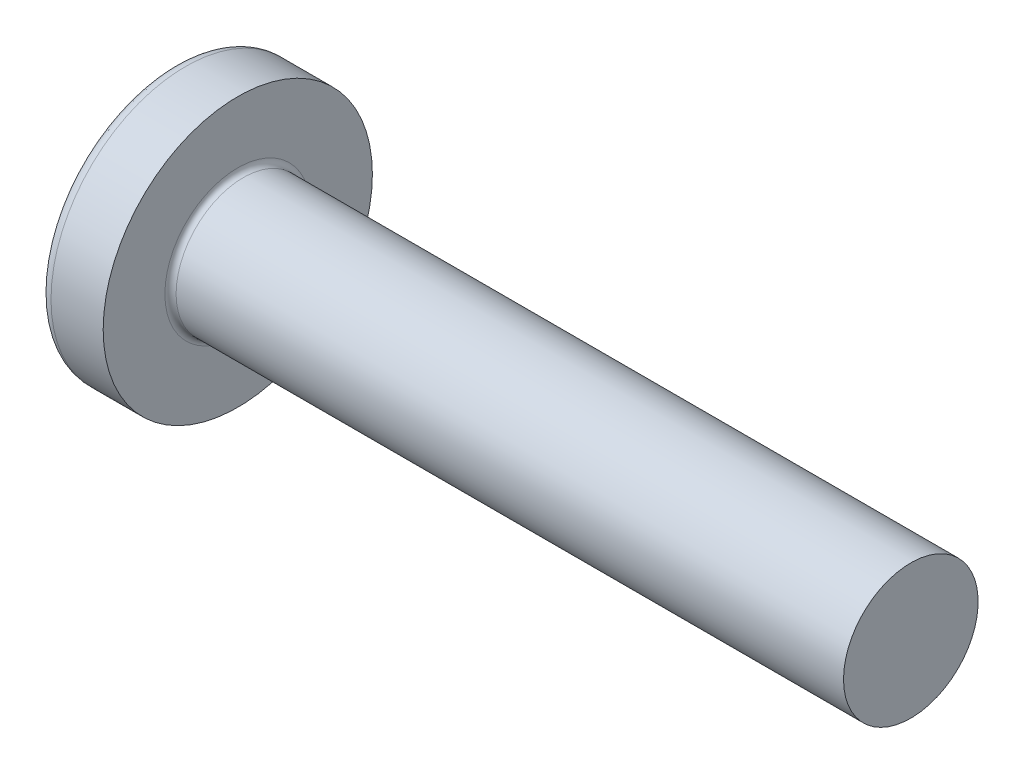
ISO-10303-21;
HEADER;
FILE_DESCRIPTION(('STEP AP214'),'2;1');
FILE_NAME('part.step','',(''),(''),'','','');
FILE_SCHEMA(('AUTOMOTIVE_DESIGN { 1 0 10303 214 1 1 1 1 }'));
ENDSEC;
DATA;
#1=APPLICATION_CONTEXT('core data for automotive mechanical design processes');
#2=APPLICATION_PROTOCOL_DEFINITION('international standard','automotive_design',2000,#1);
#3=PRODUCT_CONTEXT('',#1,'mechanical');
#4=PRODUCT('Part','Part','',(#3));
#5=PRODUCT_RELATED_PRODUCT_CATEGORY('part','',(#4));
#6=PRODUCT_DEFINITION_FORMATION('','',#4);
#7=PRODUCT_DEFINITION_CONTEXT('part definition',#1,'design');
#8=PRODUCT_DEFINITION('design','',#6,#7);
#9=PRODUCT_DEFINITION_SHAPE('','',#8);
#10=(LENGTH_UNIT() NAMED_UNIT(*) SI_UNIT(.MILLI.,.METRE.));
#11=(NAMED_UNIT(*) PLANE_ANGLE_UNIT() SI_UNIT($,.RADIAN.));
#12=(NAMED_UNIT(*) SI_UNIT($,.STERADIAN.) SOLID_ANGLE_UNIT());
#13=UNCERTAINTY_MEASURE_WITH_UNIT(LENGTH_MEASURE(1.E-05),#10,'distance_accuracy_value','');
#14=(GEOMETRIC_REPRESENTATION_CONTEXT(3) GLOBAL_UNCERTAINTY_ASSIGNED_CONTEXT((#13)) GLOBAL_UNIT_ASSIGNED_CONTEXT((#10,
#11,#12)) REPRESENTATION_CONTEXT('',''));
#15=CARTESIAN_POINT('',(0.,0.,0.));
#16=DIRECTION('',(0.,0.,1.));
#17=DIRECTION('',(1.,0.,0.));
#18=AXIS2_PLACEMENT_3D('',#15,#16,#17);
#19=CARTESIAN_POINT('',(10.,0.,0.));
#20=DIRECTION('',(-1.,0.,0.));
#21=DIRECTION('',(0.,1.,0.));
#22=AXIS2_PLACEMENT_3D('',#19,#20,#21);
#23=SPHERICAL_SURFACE('',#22,10.);
#24=CARTESIAN_POINT('',(1.83373872480848,0.,0.));
#25=DIRECTION('',(-1.,0.,0.));
#26=DIRECTION('',(0.,0.,1.));
#27=AXIS2_PLACEMENT_3D('',#24,#25,#26);
#28=CIRCLE('',#27,5.77167019027484);
#29=CARTESIAN_POINT('',(1.83373872480848,0.,5.77167019027484));
#30=VERTEX_POINT('',#29);
#31=EDGE_CURVE('E213',#30,#30,#28,.T.);
#32=ORIENTED_EDGE('',*,*,#31,.T.);
#33=EDGE_LOOP('',(#32));
#34=FACE_BOUND('',#33,.T.);
#35=CARTESIAN_POINT('',(0.11533271177369,0.,0.));
#36=DIRECTION('',(1.,0.,0.));
#37=DIRECTION('',(0.,0.,-1.));
#38=AXIS2_PLACEMENT_3D('',#35,#36,#37);
#39=CIRCLE('',#38,1.51438192047739);
#40=CARTESIAN_POINT('',(0.115332711773696,-0.709999999999994,-1.33762947076864));
#41=VERTEX_POINT('',#40);
#42=CARTESIAN_POINT('',(0.11533271177369,-1.33762947076862,-0.71));
#43=VERTEX_POINT('',#42);
#44=EDGE_CURVE('E339',#41,#43,#39,.F.);
#45=ORIENTED_EDGE('',*,*,#44,.F.);
#46=CARTESIAN_POINT('',(10.,-0.71,0.));
#47=DIRECTION('',(0.,1.,0.));
#48=DIRECTION('',(0.,0.,1.));
#49=AXIS2_PLACEMENT_3D('',#46,#47,#48);
#50=CIRCLE('',#49,9.97476315508293);
#51=CARTESIAN_POINT('',(0.516695966128057,-0.709999999999988,-3.09238493741451));
#52=VERTEX_POINT('',#51);
#53=EDGE_CURVE('E273',#52,#41,#50,.T.);
#54=ORIENTED_EDGE('',*,*,#53,.F.);
#55=CARTESIAN_POINT('',(9.3467899937754,0.,1.3101368059126));
#56=DIRECTION('',(0.446197753347436,0.,-0.894934391398443));
#57=DIRECTION('',(-0.894934391398443,0.,-0.446197753347436));
#58=AXIS2_PLACEMENT_3D('',#55,#56,#57);
#59=CIRCLE('',#58,9.89226254390578);
#60=CARTESIAN_POINT('',(0.516695966128059,0.710000000000011,-3.0923849374145));
#61=VERTEX_POINT('',#60);
#62=EDGE_CURVE('E247',#52,#61,#59,.T.);
#63=ORIENTED_EDGE('',*,*,#62,.T.);
#64=CARTESIAN_POINT('',(10.,0.71,0.));
#65=DIRECTION('',(0.,-1.,0.));
#66=DIRECTION('',(0.,0.,-1.));
#67=AXIS2_PLACEMENT_3D('',#64,#65,#66);
#68=CIRCLE('',#67,9.97476315508293);
#69=CARTESIAN_POINT('',(0.115332711773695,0.710000000000005,-1.33762947076863));
#70=VERTEX_POINT('',#69);
#71=EDGE_CURVE('E301',#70,#61,#68,.T.);
#72=ORIENTED_EDGE('',*,*,#71,.F.);
#73=CARTESIAN_POINT('',(0.11533271177369,1.33762947076861,-0.71));
#74=VERTEX_POINT('',#73);
#75=EDGE_CURVE('E354',#74,#70,#39,.F.);
#76=ORIENTED_EDGE('',*,*,#75,.F.);
#77=CARTESIAN_POINT('',(10.,0.,-0.71));
#78=DIRECTION('',(0.,0.,1.));
#79=DIRECTION('',(1.,0.,0.));
#80=AXIS2_PLACEMENT_3D('',#77,#78,#79);
#81=CIRCLE('',#80,9.97476315508293);
#82=CARTESIAN_POINT('',(0.516695966128059,3.0923849374145,-0.71));
#83=VERTEX_POINT('',#82);
#84=EDGE_CURVE('E241',#83,#74,#81,.T.);
#85=ORIENTED_EDGE('',*,*,#84,.F.);
#86=CARTESIAN_POINT('',(9.3467899937754,-1.3101368059126,0.));
#87=DIRECTION('',(0.446197753347436,0.894934391398443,0.));
#88=DIRECTION('',(-0.894934391398443,0.446197753347436,0.));
#89=AXIS2_PLACEMENT_3D('',#86,#87,#88);
#90=CIRCLE('',#89,9.89226254390578);
#91=CARTESIAN_POINT('',(0.516695966128059,3.09238493741451,0.71));
#92=VERTEX_POINT('',#91);
#93=EDGE_CURVE('E244',#83,#92,#90,.T.);
#94=ORIENTED_EDGE('',*,*,#93,.T.);
#95=CARTESIAN_POINT('',(10.,0.,0.71));
#96=DIRECTION('',(0.,0.,-1.));
#97=DIRECTION('',(-1.,0.,0.));
#98=AXIS2_PLACEMENT_3D('',#95,#96,#97);
#99=CIRCLE('',#98,9.97476315508293);
#100=CARTESIAN_POINT('',(0.11533271177369,1.33762947076861,0.709999999999999));
#101=VERTEX_POINT('',#100);
#102=EDGE_CURVE('E237',#101,#92,#99,.T.);
#103=ORIENTED_EDGE('',*,*,#102,.F.);
#104=CARTESIAN_POINT('',(0.115332711773696,0.709999999999995,1.33762947076864));
#105=VERTEX_POINT('',#104);
#106=EDGE_CURVE('E353',#105,#101,#39,.F.);
#107=ORIENTED_EDGE('',*,*,#106,.F.);
#108=CARTESIAN_POINT('',(0.516695966128059,0.709999999999989,3.09238493741451));
#109=VERTEX_POINT('',#108);
#110=EDGE_CURVE('E257',#109,#105,#68,.T.);
#111=ORIENTED_EDGE('',*,*,#110,.F.);
#112=CARTESIAN_POINT('',(9.3467899937754,0.,-1.3101368059126));
#113=DIRECTION('',(0.446197753347436,0.,0.894934391398443));
#114=DIRECTION('',(0.894934391398443,0.,-0.446197753347436));
#115=AXIS2_PLACEMENT_3D('',#112,#113,#114);
#116=CIRCLE('',#115,9.89226254390578);
#117=CARTESIAN_POINT('',(0.516695966128059,-0.710000000000011,3.0923849374145));
#118=VERTEX_POINT('',#117);
#119=EDGE_CURVE('E48',#109,#118,#116,.T.);
#120=ORIENTED_EDGE('',*,*,#119,.T.);
#121=CARTESIAN_POINT('',(0.115332711773696,-0.710000000000004,1.33762947076863));
#122=VERTEX_POINT('',#121);
#123=EDGE_CURVE('E254',#122,#118,#50,.T.);
#124=ORIENTED_EDGE('',*,*,#123,.F.);
#125=CARTESIAN_POINT('',(0.11533271177369,-1.33762947076862,0.709999999999999));
#126=VERTEX_POINT('',#125);
#127=EDGE_CURVE('E385',#126,#122,#39,.F.);
#128=ORIENTED_EDGE('',*,*,#127,.F.);
#129=CARTESIAN_POINT('',(0.516695966128059,-3.0923849374145,0.709999999999999));
#130=VERTEX_POINT('',#129);
#131=EDGE_CURVE('E238',#130,#126,#99,.T.);
#132=ORIENTED_EDGE('',*,*,#131,.F.);
#133=CARTESIAN_POINT('',(9.3467899937754,1.3101368059126,0.));
#134=DIRECTION('',(0.446197753347436,-0.894934391398443,0.));
#135=DIRECTION('',(0.894934391398443,0.446197753347436,0.));
#136=AXIS2_PLACEMENT_3D('',#133,#134,#135);
#137=CIRCLE('',#136,9.89226254390577);
#138=CARTESIAN_POINT('',(0.516695966128059,-3.0923849374145,-0.71));
#139=VERTEX_POINT('',#138);
#140=EDGE_CURVE('E234',#130,#139,#137,.T.);
#141=ORIENTED_EDGE('',*,*,#140,.T.);
#142=EDGE_CURVE('E63',#43,#139,#81,.T.);
#143=ORIENTED_EDGE('',*,*,#142,.F.);
#144=EDGE_LOOP('',(#45,#54,#63,#72,#76,#85,#94,#103,#107,#111,#120,#124,#128,#132,#141,#143));
#145=FACE_BOUND('',#144,.T.);
#146=ADVANCED_FACE('F35',(#34,#145),#23,.T.);
#147=CARTESIAN_POINT('',(3.46,1.62490792462486,-0.71));
#148=DIRECTION('',(0.,0.,1.));
#149=DIRECTION('',(1.,0.,0.));
#150=AXIS2_PLACEMENT_3D('',#147,#148,#149);
#151=PLANE('',#150);
#152=ORIENTED_EDGE('',*,*,#84,.T.);
#153=CARTESIAN_POINT('',(-2.28089704213722,1.52473965101837,-0.71));
#154=CARTESIAN_POINT('',(-1.81861622822998,1.48907386498352,-0.71));
#155=CARTESIAN_POINT('',(-1.35635131302274,1.45320000395987,-0.71));
#156=CARTESIAN_POINT('',(-0.431857761667541,1.3808964085712,-0.71));
#157=CARTESIAN_POINT('',(0.0303708738054378,1.34446666558133,-0.71));
#158=CARTESIAN_POINT('',(0.954772750089384,1.27091270389059,-0.71));
#159=CARTESIAN_POINT('',(1.41694599093296,1.23378848560061,-0.71));
#160=CARTESIAN_POINT('',(2.1101468655661,1.17741958304234,-0.71));
#161=CARTESIAN_POINT('',(2.34120225142472,1.15851633138213,-0.71));
#162=CARTESIAN_POINT('',(2.80329254149198,1.12044387603508,-0.71));
#163=CARTESIAN_POINT('',(3.03432744556049,1.10127467065167,-0.71));
#164=CARTESIAN_POINT('',(3.81376951672291,1.03608826026628,-0.71));
#165=CARTESIAN_POINT('',(4.3621185642133,0.989367924506424,-0.71));
#166=CARTESIAN_POINT('',(5.18446393534975,0.917336183170652,-0.71));
#167=CARTESIAN_POINT('',(5.45854573527601,0.893000731200899,-0.71));
#168=CARTESIAN_POINT('',(6.00663594033703,0.843493254998865,-0.71));
#169=CARTESIAN_POINT('',(6.28064434495887,0.818321225066341,-0.71));
#170=CARTESIAN_POINT('',(6.82859287274618,0.766879824151132,-0.71));
#171=CARTESIAN_POINT('',(7.10253298312854,0.740610316661091,-0.71));
#172=CARTESIAN_POINT('',(7.65026285025565,0.686585019837831,-0.71));
#173=CARTESIAN_POINT('',(7.92405260972714,0.658829258423123,-0.71));
#174=CARTESIAN_POINT('',(8.33458184018721,0.615573696383427,-0.71));
#175=CARTESIAN_POINT('',(8.4714065534312,0.600884001267348,-0.71));
#176=CARTESIAN_POINT('',(8.74498055470475,0.570826220799602,-0.71));
#177=CARTESIAN_POINT('',(8.88172984329826,0.555458140591718,-0.71));
#178=CARTESIAN_POINT('',(9.15513948220117,0.523868434617908,-0.71));
#179=CARTESIAN_POINT('',(9.29179982631773,0.507646754763106,-0.71));
#180=CARTESIAN_POINT('',(9.56498051884117,0.474039680066355,-0.71));
#181=CARTESIAN_POINT('',(9.70150086350508,0.45665425489429,-0.71));
#182=CARTESIAN_POINT('',(9.83792645731126,0.438531836217977,-0.71));
#183=B_SPLINE_CURVE_WITH_KNOTS('',3,(#153,#154,#155,#156,#157,#158,#159,#160,#161,#162,#163,
#164,#165,#166,#167,#168,#169,#170,#171,#172,#173,#174,#175,#176,#177,#178,#179,#180,#181,#182),
.UNSPECIFIED.,.F.,.F.,(4,2,2,2,2,2,2,2,2,2,2,2,2,2,4),(0.,1.39096401174475,2.78194962715189,
4.17293441960638,4.86841633218882,5.56390268344286,7.21490482310267,8.04038405799492,
8.86586891866052,9.6914567629523,10.5170291044415,10.9298607906012,11.3426893470464,
11.7555440942061,12.1684096055867),.UNSPECIFIED.);
#184=CARTESIAN_POINT('',(3.46,1.06563607765503,-0.710000000000001));
#185=VERTEX_POINT('',#184);
#186=EDGE_CURVE('E374',#74,#185,#183,.T.);
#187=ORIENTED_EDGE('',*,*,#186,.T.);
#188=DIRECTION('',(0.,1.,0.));
#189=VECTOR('',#188,1.);
#190=CARTESIAN_POINT('',(3.46,-1.62490792462486,-0.71));
#191=LINE('',#190,#189);
#192=CARTESIAN_POINT('',(3.46,1.62490792462486,-0.71));
#193=VERTEX_POINT('',#192);
#194=EDGE_CURVE('E322',#185,#193,#191,.T.);
#195=ORIENTED_EDGE('',*,*,#194,.T.);
#196=DIRECTION('',(0.894934391398442,-0.446197753347436,0.));
#197=VECTOR('',#196,1.);
#198=CARTESIAN_POINT('',(0.,3.35,-0.71));
#199=LINE('',#198,#197);
#200=EDGE_CURVE('E214',#83,#193,#199,.T.);
#201=ORIENTED_EDGE('',*,*,#200,.F.);
#202=EDGE_LOOP('',(#152,#187,#195,#201));
#203=FACE_BOUND('',#202,.T.);
#204=ADVANCED_FACE('F169',(#203),#151,.T.);
#205=CARTESIAN_POINT('',(3.46,-1.62490792462486,-0.71));
#206=VERTEX_POINT('',#205);
#207=CARTESIAN_POINT('',(3.46,-1.06563607765503,-0.710000000000001));
#208=VERTEX_POINT('',#207);
#209=EDGE_CURVE('E222',#206,#208,#191,.T.);
#210=ORIENTED_EDGE('',*,*,#209,.T.);
#211=CARTESIAN_POINT('',(-2.28089704213722,-1.52473965101837,-0.71));
#212=CARTESIAN_POINT('',(-1.81861622822998,-1.48907386498352,-0.71));
#213=CARTESIAN_POINT('',(-1.35635131302274,-1.45320000395987,-0.71));
#214=CARTESIAN_POINT('',(-0.431857761667542,-1.3808964085712,-0.71));
#215=CARTESIAN_POINT('',(0.0303708738054366,-1.34446666558133,-0.71));
#216=CARTESIAN_POINT('',(0.954772750089383,-1.27091270389059,-0.71));
#217=CARTESIAN_POINT('',(1.41694599093296,-1.23378848560061,-0.71));
#218=CARTESIAN_POINT('',(2.1101468655661,-1.17741958304234,-0.71));
#219=CARTESIAN_POINT('',(2.34120225142472,-1.15851633138213,-0.71));
#220=CARTESIAN_POINT('',(2.80329254149198,-1.12044387603508,-0.71));
#221=CARTESIAN_POINT('',(3.03432744556049,-1.10127467065167,-0.71));
#222=CARTESIAN_POINT('',(3.81376951672291,-1.03608826026628,-0.71));
#223=CARTESIAN_POINT('',(4.3621185642133,-0.989367924506424,-0.71));
#224=CARTESIAN_POINT('',(5.18446393534975,-0.917336183170652,-0.71));
#225=CARTESIAN_POINT('',(5.45854573527601,-0.893000731200899,-0.71));
#226=CARTESIAN_POINT('',(6.00663594033703,-0.843493254998865,-0.71));
#227=CARTESIAN_POINT('',(6.28064434495887,-0.818321225066341,-0.71));
#228=CARTESIAN_POINT('',(6.82859287274618,-0.766879824151132,-0.71));
#229=CARTESIAN_POINT('',(7.10253298312854,-0.74061031666109,-0.71));
#230=CARTESIAN_POINT('',(7.65026285025566,-0.686585019837831,-0.71));
#231=CARTESIAN_POINT('',(7.92405260972715,-0.658829258423122,-0.71));
#232=CARTESIAN_POINT('',(8.33458184018721,-0.615573696383426,-0.71));
#233=CARTESIAN_POINT('',(8.4714065534312,-0.600884001267348,-0.71));
#234=CARTESIAN_POINT('',(8.74498055470476,-0.570826220799602,-0.71));
#235=CARTESIAN_POINT('',(8.88172984329827,-0.555458140591717,-0.71));
#236=CARTESIAN_POINT('',(9.15513948220118,-0.523868434617907,-0.71));
#237=CARTESIAN_POINT('',(9.29179982631774,-0.507646754763106,-0.71));
#238=CARTESIAN_POINT('',(9.56498051884117,-0.474039680066355,-0.71));
#239=CARTESIAN_POINT('',(9.70150086350509,-0.456654254894289,-0.71));
#240=CARTESIAN_POINT('',(9.83792645731127,-0.438531836217976,-0.71));
#241=B_SPLINE_CURVE_WITH_KNOTS('',3,(#211,#212,#213,#214,#215,#216,#217,#218,#219,#220,#221,
#222,#223,#224,#225,#226,#227,#228,#229,#230,#231,#232,#233,#234,#235,#236,#237,#238,#239,#240),
.UNSPECIFIED.,.F.,.F.,(4,2,2,2,2,2,2,2,2,2,2,2,2,2,4),(0.,1.39096401174475,2.78194962715189,
4.17293441960638,4.86841633218882,5.56390268344286,7.21490482310267,8.04038405799492,
8.86586891866053,9.69145676295231,10.5170291044415,10.9298607906012,11.3426893470464,
11.7555440942062,12.1684096055867),.UNSPECIFIED.);
#242=EDGE_CURVE('E352',#208,#43,#241,.F.);
#243=ORIENTED_EDGE('',*,*,#242,.T.);
#244=ORIENTED_EDGE('',*,*,#142,.T.);
#245=DIRECTION('',(0.894934391398442,0.446197753347436,0.));
#246=VECTOR('',#245,1.);
#247=CARTESIAN_POINT('',(0.,-3.35,-0.71));
#248=LINE('',#247,#246);
#249=EDGE_CURVE('E304',#139,#206,#248,.T.);
#250=ORIENTED_EDGE('',*,*,#249,.T.);
#251=EDGE_LOOP('',(#210,#243,#244,#250));
#252=FACE_BOUND('',#251,.T.);
#253=ADVANCED_FACE('F175',(#252),#151,.T.);
#254=CARTESIAN_POINT('',(3.46,-1.62490792462486,0.71));
#255=DIRECTION('',(0.,0.,-1.));
#256=DIRECTION('',(-1.,0.,0.));
#257=AXIS2_PLACEMENT_3D('',#254,#255,#256);
#258=PLANE('',#257);
#259=DIRECTION('',(0.,-1.,0.));
#260=VECTOR('',#259,1.);
#261=CARTESIAN_POINT('',(3.46,1.62490792462486,0.71));
#262=LINE('',#261,#260);
#263=CARTESIAN_POINT('',(3.46,1.62490792462486,0.71));
#264=VERTEX_POINT('',#263);
#265=CARTESIAN_POINT('',(3.46,1.06563607765503,0.71));
#266=VERTEX_POINT('',#265);
#267=EDGE_CURVE('E312',#264,#266,#262,.T.);
#268=ORIENTED_EDGE('',*,*,#267,.T.);
#269=CARTESIAN_POINT('',(-2.28089705027091,1.52473965164577,0.709999999999999));
#270=CARTESIAN_POINT('',(-1.81861623532717,1.48907386553353,0.709999999999999));
#271=CARTESIAN_POINT('',(-1.35635131908348,1.45320000443187,0.709999999999999));
#272=CARTESIAN_POINT('',(-0.431857765655443,1.38089640888514,0.709999999999999));
#273=CARTESIAN_POINT('',(0.030370870853924,1.3444666658152,0.709999999999999));
#274=CARTESIAN_POINT('',(0.954772749881989,1.27091270390807,0.709999999999999));
#275=CARTESIAN_POINT('',(1.41694599243322,1.23378848548075,0.709999999999999));
#276=CARTESIAN_POINT('',(2.11014686962733,1.17741958271103,0.709999999999999));
#277=CARTESIAN_POINT('',(2.3412022563395,1.15851633097942,0.71));
#278=CARTESIAN_POINT('',(2.80329254811369,1.12044387548729,0.71));
#279=CARTESIAN_POINT('',(3.03432745303557,1.10127467003019,0.71));
#280=CARTESIAN_POINT('',(3.8137695250509,1.03608825956087,0.71));
#281=CARTESIAN_POINT('',(4.36211857254078,0.989367923790553,0.71));
#282=CARTESIAN_POINT('',(5.18446394367596,0.917336182434635,0.71));
#283=CARTESIAN_POINT('',(5.45854574360167,0.893000730457428,0.71));
#284=CARTESIAN_POINT('',(6.00663594866141,0.843493254238335,0.71));
#285=CARTESIAN_POINT('',(6.28064435328252,0.818321224296205,0.71));
#286=CARTESIAN_POINT('',(6.82859288106826,0.766879823358567,0.71));
#287=CARTESIAN_POINT('',(7.1025329914498,0.7406103158557,0.71));
#288=CARTESIAN_POINT('',(7.65026285857465,0.686585019001786,0.71));
#289=CARTESIAN_POINT('',(7.92405261804469,0.658829257569248,0.71));
#290=CARTESIAN_POINT('',(8.3345818485019,0.61557369549618,0.71));
#291=CARTESIAN_POINT('',(8.47140656174489,0.600884000367864,0.71));
#292=CARTESIAN_POINT('',(8.74498056301602,0.570826219872502,0.71));
#293=CARTESIAN_POINT('',(8.8817298516081,0.555458139649237,0.71));
#294=CARTESIAN_POINT('',(9.15513949050764,0.523868433640255,0.71));
#295=CARTESIAN_POINT('',(9.29179983462227,0.50764675376566,0.710000000000001));
#296=CARTESIAN_POINT('',(9.56498052714077,0.474039679022047,0.710000000000001));
#297=CARTESIAN_POINT('',(9.70150087180168,0.456654253822913,0.710000000000001));
#298=CARTESIAN_POINT('',(9.83792646560407,0.438531835114464,0.710000000000001));
#299=B_SPLINE_CURVE_WITH_KNOTS('',3,(#269,#270,#271,#272,#273,#274,#275,#276,#277,#278,#279,
#280,#281,#282,#283,#284,#285,#286,#287,#288,#289,#290,#291,#292,#293,#294,#295,#296,#297,#298),
.UNSPECIFIED.,.F.,.F.,(4,2,2,2,2,2,2,2,2,2,2,2,2,2,4),(0.,1.39096401486289,2.78194963338846,
4.17293443098243,4.86841634613445,5.56390269995814,7.21490483961907,8.04038407451168,
8.8658689351777,9.69145677947068,10.5170291209609,10.9298608071215,11.3426893635676,
11.7555441107285,12.1684096221104),.UNSPECIFIED.);
#300=EDGE_CURVE('E278',#266,#101,#299,.F.);
#301=ORIENTED_EDGE('',*,*,#300,.T.);
#302=ORIENTED_EDGE('',*,*,#102,.T.);
#303=DIRECTION('',(0.894934391398442,-0.446197753347436,0.));
#304=VECTOR('',#303,1.);
#305=CARTESIAN_POINT('',(0.,3.35,0.71));
#306=LINE('',#305,#304);
#307=EDGE_CURVE('E219',#92,#264,#306,.T.);
#308=ORIENTED_EDGE('',*,*,#307,.T.);
#309=EDGE_LOOP('',(#268,#301,#302,#308));
#310=FACE_BOUND('',#309,.T.);
#311=ADVANCED_FACE('F370',(#310),#258,.T.);
#312=ORIENTED_EDGE('',*,*,#131,.T.);
#313=CARTESIAN_POINT('',(-2.28089705027091,-1.52473965164577,0.709999999999999));
#314=CARTESIAN_POINT('',(-1.81861623532717,-1.48907386553353,0.709999999999999));
#315=CARTESIAN_POINT('',(-1.35635131908348,-1.45320000443187,0.709999999999999));
#316=CARTESIAN_POINT('',(-0.431857765655443,-1.38089640888514,0.709999999999999));
#317=CARTESIAN_POINT('',(0.0303708708539241,-1.3444666658152,0.709999999999999));
#318=CARTESIAN_POINT('',(0.954772749881989,-1.27091270390807,0.709999999999999));
#319=CARTESIAN_POINT('',(1.41694599243322,-1.23378848548075,0.709999999999999));
#320=CARTESIAN_POINT('',(2.11014686962733,-1.17741958271103,0.709999999999999));
#321=CARTESIAN_POINT('',(2.3412022563395,-1.15851633097942,0.709999999999999));
#322=CARTESIAN_POINT('',(2.80329254811369,-1.12044387548729,0.709999999999999));
#323=CARTESIAN_POINT('',(3.03432745303557,-1.10127467003019,0.71));
#324=CARTESIAN_POINT('',(3.81376952505089,-1.03608825956087,0.71));
#325=CARTESIAN_POINT('',(4.36211857254078,-0.989367923790553,0.71));
#326=CARTESIAN_POINT('',(5.18446394367596,-0.917336182434635,0.71));
#327=CARTESIAN_POINT('',(5.45854574360167,-0.893000730457428,0.71));
#328=CARTESIAN_POINT('',(6.00663594866141,-0.843493254238335,0.71));
#329=CARTESIAN_POINT('',(6.28064435328252,-0.818321224296205,0.71));
#330=CARTESIAN_POINT('',(6.82859288106826,-0.766879823358567,0.71));
#331=CARTESIAN_POINT('',(7.1025329914498,-0.7406103158557,0.71));
#332=CARTESIAN_POINT('',(7.65026285857464,-0.686585019001786,0.71));
#333=CARTESIAN_POINT('',(7.92405261804469,-0.658829257569248,0.71));
#334=CARTESIAN_POINT('',(8.3345818485019,-0.615573695496181,0.71));
#335=CARTESIAN_POINT('',(8.47140656174489,-0.600884000367865,0.71));
#336=CARTESIAN_POINT('',(8.74498056301602,-0.570826219872502,0.71));
#337=CARTESIAN_POINT('',(8.8817298516081,-0.555458139649238,0.71));
#338=CARTESIAN_POINT('',(9.15513949050764,-0.523868433640255,0.71));
#339=CARTESIAN_POINT('',(9.29179983462227,-0.50764675376566,0.71));
#340=CARTESIAN_POINT('',(9.56498052714077,-0.474039679022048,0.71));
#341=CARTESIAN_POINT('',(9.70150087180168,-0.456654253822913,0.71));
#342=CARTESIAN_POINT('',(9.83792646560407,-0.438531835114465,0.710000000000001));
#343=B_SPLINE_CURVE_WITH_KNOTS('',3,(#313,#314,#315,#316,#317,#318,#319,#320,#321,#322,#323,
#324,#325,#326,#327,#328,#329,#330,#331,#332,#333,#334,#335,#336,#337,#338,#339,#340,#341,#342),
.UNSPECIFIED.,.F.,.F.,(4,2,2,2,2,2,2,2,2,2,2,2,2,2,4),(0.,1.39096401486289,2.78194963338846,
4.17293443098243,4.86841634613445,5.56390269995814,7.21490483961907,8.04038407451168,
8.8658689351777,9.69145677947068,10.5170291209609,10.9298608071215,11.3426893635676,
11.7555441107285,12.1684096221104),.UNSPECIFIED.);
#344=CARTESIAN_POINT('',(3.46,-1.06563607765503,0.71));
#345=VERTEX_POINT('',#344);
#346=EDGE_CURVE('E386',#126,#345,#343,.T.);
#347=ORIENTED_EDGE('',*,*,#346,.T.);
#348=CARTESIAN_POINT('',(3.46,-1.62490792462486,0.71));
#349=VERTEX_POINT('',#348);
#350=EDGE_CURVE('E314',#345,#349,#262,.T.);
#351=ORIENTED_EDGE('',*,*,#350,.T.);
#352=DIRECTION('',(0.894934391398442,0.446197753347436,0.));
#353=VECTOR('',#352,1.);
#354=CARTESIAN_POINT('',(0.,-3.35,0.709999999999999));
#355=LINE('',#354,#353);
#356=EDGE_CURVE('E306',#130,#349,#355,.T.);
#357=ORIENTED_EDGE('',*,*,#356,.F.);
#358=EDGE_LOOP('',(#312,#347,#351,#357));
#359=FACE_BOUND('',#358,.T.);
#360=ADVANCED_FACE('F415',(#359),#258,.T.);
#361=CARTESIAN_POINT('',(3.46,1.62490792462486,-0.71));
#362=DIRECTION('',(-1.,0.,0.));
#363=DIRECTION('',(0.,0.,1.));
#364=AXIS2_PLACEMENT_3D('',#361,#362,#363);
#365=PLANE('',#364);
#366=ORIENTED_EDGE('',*,*,#350,.F.);
#367=CARTESIAN_POINT('',(3.46,0.,0.));
#368=DIRECTION('',(-1.,0.,0.));
#369=DIRECTION('',(0.,0.,1.));
#370=AXIS2_PLACEMENT_3D('',#367,#368,#369);
#371=CIRCLE('',#370,1.2805);
#372=EDGE_CURVE('E347',#208,#345,#371,.T.);
#373=ORIENTED_EDGE('',*,*,#372,.F.);
#374=ORIENTED_EDGE('',*,*,#209,.F.);
#375=DIRECTION('',(0.,0.,1.));
#376=VECTOR('',#375,1.);
#377=CARTESIAN_POINT('',(3.46,-1.62490792462486,-0.71));
#378=LINE('',#377,#376);
#379=EDGE_CURVE('E309',#206,#349,#378,.T.);
#380=ORIENTED_EDGE('',*,*,#379,.T.);
#381=EDGE_LOOP('',(#366,#373,#374,#380));
#382=FACE_BOUND('',#381,.T.);
#383=ADVANCED_FACE('F408',(#382),#365,.T.);
#384=DIRECTION('',(0.,0.,-1.));
#385=VECTOR('',#384,1.);
#386=CARTESIAN_POINT('',(3.46,-0.710000000000005,1.62490792462486));
#387=LINE('',#386,#385);
#388=CARTESIAN_POINT('',(3.46,-0.709999999999996,-1.06563607765503));
#389=VERTEX_POINT('',#388);
#390=CARTESIAN_POINT('',(3.46,-0.709999999999994,-1.62490792462486));
#391=VERTEX_POINT('',#390);
#392=EDGE_CURVE('E295',#389,#391,#387,.T.);
#393=ORIENTED_EDGE('',*,*,#392,.F.);
#394=CARTESIAN_POINT('',(3.46,0.710000000000004,-1.06563607765503));
#395=VERTEX_POINT('',#394);
#396=EDGE_CURVE('E55',#395,#389,#371,.T.);
#397=ORIENTED_EDGE('',*,*,#396,.F.);
#398=DIRECTION('',(0.,0.,1.));
#399=VECTOR('',#398,1.);
#400=CARTESIAN_POINT('',(3.46,0.710000000000006,-1.62490792462486));
#401=LINE('',#400,#399);
#402=CARTESIAN_POINT('',(3.46,0.710000000000006,-1.62490792462486));
#403=VERTEX_POINT('',#402);
#404=EDGE_CURVE('E298',#403,#395,#401,.T.);
#405=ORIENTED_EDGE('',*,*,#404,.F.);
#406=DIRECTION('',(0.,-1.,0.));
#407=VECTOR('',#406,1.);
#408=CARTESIAN_POINT('',(3.46,0.710000000000006,-1.62490792462486));
#409=LINE('',#408,#407);
#410=EDGE_CURVE('E289',#403,#391,#409,.T.);
#411=ORIENTED_EDGE('',*,*,#410,.T.);
#412=EDGE_LOOP('',(#393,#397,#405,#411));
#413=FACE_BOUND('',#412,.T.);
#414=ADVANCED_FACE('F342',(#413),#365,.T.);
#415=ORIENTED_EDGE('',*,*,#194,.F.);
#416=EDGE_CURVE('E346',#266,#185,#371,.T.);
#417=ORIENTED_EDGE('',*,*,#416,.F.);
#418=ORIENTED_EDGE('',*,*,#267,.F.);
#419=DIRECTION('',(0.,0.,-1.));
#420=VECTOR('',#419,1.);
#421=CARTESIAN_POINT('',(3.46,1.62490792462486,0.71));
#422=LINE('',#421,#420);
#423=EDGE_CURVE('E315',#264,#193,#422,.T.);
#424=ORIENTED_EDGE('',*,*,#423,.T.);
#425=EDGE_LOOP('',(#415,#417,#418,#424));
#426=FACE_BOUND('',#425,.T.);
#427=ADVANCED_FACE('F409',(#426),#365,.T.);
#428=CARTESIAN_POINT('',(3.46,0.709999999999994,1.62490792462486));
#429=DIRECTION('',(0.,-1.,0.));
#430=DIRECTION('',(1.,0.,0.));
#431=AXIS2_PLACEMENT_3D('',#428,#429,#430);
#432=PLANE('',#431);
#433=ORIENTED_EDGE('',*,*,#110,.T.);
#434=CARTESIAN_POINT('',(-2.28089704213722,0.709999999999995,1.52473965101837));
#435=CARTESIAN_POINT('',(-1.81861622822998,0.709999999999995,1.48907386498352));
#436=CARTESIAN_POINT('',(-1.35635131302274,0.709999999999995,1.45320000395987));
#437=CARTESIAN_POINT('',(-0.431857761667543,0.709999999999995,1.38089640857121));
#438=CARTESIAN_POINT('',(0.0303708738054362,0.709999999999995,1.34446666558134));
#439=CARTESIAN_POINT('',(0.954772750089383,0.709999999999995,1.2709127038906));
#440=CARTESIAN_POINT('',(1.41694599093296,0.709999999999996,1.23378848560061));
#441=CARTESIAN_POINT('',(2.1101468655661,0.709999999999996,1.17741958304234));
#442=CARTESIAN_POINT('',(2.34120225142472,0.709999999999996,1.15851633138213));
#443=CARTESIAN_POINT('',(2.80329254149198,0.709999999999996,1.12044387603508));
#444=CARTESIAN_POINT('',(3.03432744556048,0.709999999999996,1.10127467065167));
#445=CARTESIAN_POINT('',(3.81376951672291,0.709999999999996,1.03608826026628));
#446=CARTESIAN_POINT('',(4.3621185642133,0.709999999999997,0.989367924506427));
#447=CARTESIAN_POINT('',(5.18446393534975,0.709999999999997,0.917336183170655));
#448=CARTESIAN_POINT('',(5.45854573527601,0.709999999999997,0.893000731200901));
#449=CARTESIAN_POINT('',(6.00663594033703,0.709999999999997,0.843493254998868));
#450=CARTESIAN_POINT('',(6.28064434495887,0.709999999999997,0.818321225066344));
#451=CARTESIAN_POINT('',(6.82859287274618,0.709999999999997,0.766879824151135));
#452=CARTESIAN_POINT('',(7.10253298312854,0.709999999999997,0.740610316661093));
#453=CARTESIAN_POINT('',(7.65026285025565,0.709999999999998,0.686585019837834));
#454=CARTESIAN_POINT('',(7.92405260972714,0.709999999999998,0.658829258423125));
#455=CARTESIAN_POINT('',(8.33458184018721,0.709999999999998,0.615573696383429));
#456=CARTESIAN_POINT('',(8.4714065534312,0.709999999999998,0.60088400126735));
#457=CARTESIAN_POINT('',(8.74498055470476,0.709999999999998,0.570826220799605));
#458=CARTESIAN_POINT('',(8.88172984329826,0.709999999999998,0.55545814059172));
#459=CARTESIAN_POINT('',(9.15513948220117,0.709999999999998,0.52386843461791));
#460=CARTESIAN_POINT('',(9.29179982631774,0.709999999999998,0.507646754763109));
#461=CARTESIAN_POINT('',(9.56498051884117,0.709999999999998,0.474039680066358));
#462=CARTESIAN_POINT('',(9.70150086350508,0.709999999999998,0.456654254894292));
#463=CARTESIAN_POINT('',(9.83792645731126,0.709999999999998,0.438531836217979));
#464=B_SPLINE_CURVE_WITH_KNOTS('',3,(#434,#435,#436,#437,#438,#439,#440,#441,#442,#443,#444,
#445,#446,#447,#448,#449,#450,#451,#452,#453,#454,#455,#456,#457,#458,#459,#460,#461,#462,#463),
.UNSPECIFIED.,.F.,.F.,(4,2,2,2,2,2,2,2,2,2,2,2,2,2,4),(0.,1.39096401174475,2.78194962715189,
4.17293441960638,4.86841633218882,5.56390268344286,7.21490482310267,8.04038405799492,
8.86586891866053,9.69145676295231,10.5170291044415,10.9298607906012,11.3426893470464,
11.7555440942062,12.1684096055867),.UNSPECIFIED.);
#465=CARTESIAN_POINT('',(3.46,0.709999999999996,1.06563607765503));
#466=VERTEX_POINT('',#465);
#467=EDGE_CURVE('E433',#105,#466,#464,.T.);
#468=ORIENTED_EDGE('',*,*,#467,.T.);
#469=CARTESIAN_POINT('',(3.46,0.709999999999994,1.62490792462486));
#470=VERTEX_POINT('',#469);
#471=EDGE_CURVE('E271',#466,#470,#401,.T.);
#472=ORIENTED_EDGE('',*,*,#471,.T.);
#473=DIRECTION('',(0.894934391398442,0.,-0.446197753347436));
#474=VECTOR('',#473,1.);
#475=CARTESIAN_POINT('',(0.,0.709999999999988,3.35));
#476=LINE('',#475,#474);
#477=EDGE_CURVE('E264',#109,#470,#476,.T.);
#478=ORIENTED_EDGE('',*,*,#477,.F.);
#479=EDGE_LOOP('',(#433,#468,#472,#478));
#480=FACE_BOUND('',#479,.T.);
#481=ADVANCED_FACE('F268',(#480),#432,.T.);
#482=CARTESIAN_POINT('',(3.46,-0.709999999999994,-1.62490792462486));
#483=DIRECTION('',(0.,1.,0.));
#484=DIRECTION('',(-1.,0.,0.));
#485=AXIS2_PLACEMENT_3D('',#482,#483,#484);
#486=PLANE('',#485);
#487=CARTESIAN_POINT('',(3.46,-0.710000000000005,1.62490792462486));
#488=VERTEX_POINT('',#487);
#489=CARTESIAN_POINT('',(3.46,-0.710000000000003,1.06563607765503));
#490=VERTEX_POINT('',#489);
#491=EDGE_CURVE('E292',#488,#490,#387,.T.);
#492=ORIENTED_EDGE('',*,*,#491,.T.);
#493=CARTESIAN_POINT('',(-2.28089704213722,-0.710000000000004,1.52473965101837));
#494=CARTESIAN_POINT('',(-1.81861622822998,-0.710000000000004,1.48907386498351));
#495=CARTESIAN_POINT('',(-1.35635131302274,-0.710000000000004,1.45320000395987));
#496=CARTESIAN_POINT('',(-0.431857761667543,-0.710000000000004,1.3808964085712));
#497=CARTESIAN_POINT('',(0.0303708738054362,-0.710000000000004,1.34446666558133));
#498=CARTESIAN_POINT('',(0.954772750089382,-0.710000000000004,1.27091270389059));
#499=CARTESIAN_POINT('',(1.41694599093296,-0.710000000000004,1.23378848560061));
#500=CARTESIAN_POINT('',(2.1101468655661,-0.710000000000004,1.17741958304234));
#501=CARTESIAN_POINT('',(2.34120225142472,-0.710000000000004,1.15851633138212));
#502=CARTESIAN_POINT('',(2.80329254149198,-0.710000000000004,1.12044387603508));
#503=CARTESIAN_POINT('',(3.03432744556048,-0.710000000000004,1.10127467065167));
#504=CARTESIAN_POINT('',(3.81376951672291,-0.710000000000004,1.03608826026627));
#505=CARTESIAN_POINT('',(4.3621185642133,-0.710000000000003,0.989367924506422));
#506=CARTESIAN_POINT('',(5.18446393534975,-0.710000000000003,0.91733618317065));
#507=CARTESIAN_POINT('',(5.45854573527601,-0.710000000000003,0.893000731200896));
#508=CARTESIAN_POINT('',(6.00663594033703,-0.710000000000003,0.843493254998862));
#509=CARTESIAN_POINT('',(6.28064434495887,-0.710000000000003,0.818321225066338));
#510=CARTESIAN_POINT('',(6.82859287274618,-0.710000000000003,0.766879824151129));
#511=CARTESIAN_POINT('',(7.10253298312854,-0.710000000000003,0.740610316661088));
#512=CARTESIAN_POINT('',(7.65026285025565,-0.710000000000003,0.686585019837828));
#513=CARTESIAN_POINT('',(7.92405260972714,-0.710000000000003,0.658829258423119));
#514=CARTESIAN_POINT('',(8.33458184018721,-0.710000000000003,0.615573696383424));
#515=CARTESIAN_POINT('',(8.4714065534312,-0.710000000000003,0.600884001267345));
#516=CARTESIAN_POINT('',(8.74498055470476,-0.710000000000003,0.570826220799599));
#517=CARTESIAN_POINT('',(8.88172984329826,-0.710000000000002,0.555458140591714));
#518=CARTESIAN_POINT('',(9.15513948220117,-0.710000000000002,0.523868434617904));
#519=CARTESIAN_POINT('',(9.29179982631774,-0.710000000000002,0.507646754763103));
#520=CARTESIAN_POINT('',(9.56498051884117,-0.710000000000002,0.474039680066352));
#521=CARTESIAN_POINT('',(9.70150086350508,-0.710000000000002,0.456654254894286));
#522=CARTESIAN_POINT('',(9.83792645731126,-0.710000000000002,0.438531836217973));
#523=B_SPLINE_CURVE_WITH_KNOTS('',3,(#493,#494,#495,#496,#497,#498,#499,#500,#501,#502,#503,
#504,#505,#506,#507,#508,#509,#510,#511,#512,#513,#514,#515,#516,#517,#518,#519,#520,#521,#522),
.UNSPECIFIED.,.F.,.F.,(4,2,2,2,2,2,2,2,2,2,2,2,2,2,4),(0.,1.39096401174475,2.78194962715189,
4.17293441960638,4.86841633218882,5.56390268344286,7.21490482310267,8.04038405799493,
8.86586891866053,9.69145676295231,10.5170291044415,10.9298607906012,11.3426893470464,
11.7555440942062,12.1684096055867),.UNSPECIFIED.);
#524=EDGE_CURVE('E379',#490,#122,#523,.F.);
#525=ORIENTED_EDGE('',*,*,#524,.T.);
#526=ORIENTED_EDGE('',*,*,#123,.T.);
#527=DIRECTION('',(0.894934391398442,0.,-0.446197753347436));
#528=VECTOR('',#527,1.);
#529=CARTESIAN_POINT('',(0.,-0.710000000000011,3.35));
#530=LINE('',#529,#528);
#531=EDGE_CURVE('E266',#118,#488,#530,.T.);
#532=ORIENTED_EDGE('',*,*,#531,.T.);
#533=EDGE_LOOP('',(#492,#525,#526,#532));
#534=FACE_BOUND('',#533,.T.);
#535=ADVANCED_FACE('F204',(#534),#486,.T.);
#536=ORIENTED_EDGE('',*,*,#404,.T.);
#537=CARTESIAN_POINT('',(-2.28089704213722,0.710000000000005,-1.52473965101837));
#538=CARTESIAN_POINT('',(-1.81861622822998,0.710000000000005,-1.48907386498351));
#539=CARTESIAN_POINT('',(-1.35635131302274,0.710000000000005,-1.45320000395986));
#540=CARTESIAN_POINT('',(-0.431857761667541,0.710000000000005,-1.3808964085712));
#541=CARTESIAN_POINT('',(0.0303708738054379,0.710000000000005,-1.34446666558133));
#542=CARTESIAN_POINT('',(0.954772750089384,0.710000000000004,-1.27091270389059));
#543=CARTESIAN_POINT('',(1.41694599093296,0.710000000000004,-1.23378848560061));
#544=CARTESIAN_POINT('',(2.1101468655661,0.710000000000004,-1.17741958304234));
#545=CARTESIAN_POINT('',(2.34120225142472,0.710000000000004,-1.15851633138212));
#546=CARTESIAN_POINT('',(2.80329254149198,0.710000000000004,-1.12044387603508));
#547=CARTESIAN_POINT('',(3.03432744556049,0.710000000000004,-1.10127467065166));
#548=CARTESIAN_POINT('',(3.81376951672291,0.710000000000004,-1.03608826026627));
#549=CARTESIAN_POINT('',(4.3621185642133,0.710000000000004,-0.989367924506422));
#550=CARTESIAN_POINT('',(5.18446393534976,0.710000000000003,-0.91733618317065));
#551=CARTESIAN_POINT('',(5.45854573527601,0.710000000000003,-0.893000731200896));
#552=CARTESIAN_POINT('',(6.00663594033703,0.710000000000003,-0.843493254998863));
#553=CARTESIAN_POINT('',(6.28064434495887,0.710000000000003,-0.818321225066339));
#554=CARTESIAN_POINT('',(6.82859287274618,0.710000000000003,-0.76687982415113));
#555=CARTESIAN_POINT('',(7.10253298312854,0.710000000000003,-0.740610316661088));
#556=CARTESIAN_POINT('',(7.65026285025566,0.710000000000002,-0.686585019837829));
#557=CARTESIAN_POINT('',(7.92405260972714,0.710000000000002,-0.65882925842312));
#558=CARTESIAN_POINT('',(8.33458184018721,0.710000000000002,-0.615573696383424));
#559=CARTESIAN_POINT('',(8.4714065534312,0.710000000000002,-0.600884001267346));
#560=CARTESIAN_POINT('',(8.74498055470475,0.710000000000002,-0.5708262207996));
#561=CARTESIAN_POINT('',(8.88172984329826,0.710000000000002,-0.555458140591715));
#562=CARTESIAN_POINT('',(9.15513948220117,0.710000000000002,-0.523868434617905));
#563=CARTESIAN_POINT('',(9.29179982631773,0.710000000000002,-0.507646754763104));
#564=CARTESIAN_POINT('',(9.56498051884117,0.710000000000002,-0.474039680066353));
#565=CARTESIAN_POINT('',(9.70150086350508,0.710000000000001,-0.456654254894288));
#566=CARTESIAN_POINT('',(9.83792645731126,0.710000000000001,-0.438531836217974));
#567=B_SPLINE_CURVE_WITH_KNOTS('',3,(#537,#538,#539,#540,#541,#542,#543,#544,#545,#546,#547,
#548,#549,#550,#551,#552,#553,#554,#555,#556,#557,#558,#559,#560,#561,#562,#563,#564,#565,#566),
.UNSPECIFIED.,.F.,.F.,(4,2,2,2,2,2,2,2,2,2,2,2,2,2,4),(0.,1.39096401174475,2.78194962715189,
4.17293441960638,4.86841633218882,5.56390268344286,7.21490482310267,8.04038405799492,
8.86586891866053,9.69145676295231,10.5170291044415,10.9298607906012,11.3426893470464,
11.7555440942061,12.1684096055867),.UNSPECIFIED.);
#568=EDGE_CURVE('E331',#395,#70,#567,.F.);
#569=ORIENTED_EDGE('',*,*,#568,.T.);
#570=ORIENTED_EDGE('',*,*,#71,.T.);
#571=DIRECTION('',(0.894934391398442,0.,0.446197753347436));
#572=VECTOR('',#571,1.);
#573=CARTESIAN_POINT('',(0.,0.710000000000012,-3.35));
#574=LINE('',#573,#572);
#575=EDGE_CURVE('E275',#61,#403,#574,.T.);
#576=ORIENTED_EDGE('',*,*,#575,.T.);
#577=EDGE_LOOP('',(#536,#569,#570,#576));
#578=FACE_BOUND('',#577,.T.);
#579=ADVANCED_FACE('F202',(#578),#432,.T.);
#580=ORIENTED_EDGE('',*,*,#53,.T.);
#581=CARTESIAN_POINT('',(-2.28089704213722,-0.709999999999993,-1.52473965101837));
#582=CARTESIAN_POINT('',(-1.81861622822998,-0.709999999999994,-1.48907386498352));
#583=CARTESIAN_POINT('',(-1.35635131302274,-0.709999999999994,-1.45320000395987));
#584=CARTESIAN_POINT('',(-0.431857761667543,-0.709999999999994,-1.38089640857121));
#585=CARTESIAN_POINT('',(0.0303708738054362,-0.709999999999994,-1.34446666558134));
#586=CARTESIAN_POINT('',(0.954772750089383,-0.709999999999995,-1.2709127038906));
#587=CARTESIAN_POINT('',(1.41694599093296,-0.709999999999995,-1.23378848560061));
#588=CARTESIAN_POINT('',(2.1101468655661,-0.709999999999995,-1.17741958304235));
#589=CARTESIAN_POINT('',(2.34120225142472,-0.709999999999995,-1.15851633138213));
#590=CARTESIAN_POINT('',(2.80329254149198,-0.709999999999996,-1.12044387603508));
#591=CARTESIAN_POINT('',(3.03432744556048,-0.709999999999996,-1.10127467065167));
#592=CARTESIAN_POINT('',(3.81376951672291,-0.709999999999996,-1.03608826026628));
#593=CARTESIAN_POINT('',(4.3621185642133,-0.709999999999996,-0.989367924506427));
#594=CARTESIAN_POINT('',(5.18446393534975,-0.709999999999997,-0.917336183170655));
#595=CARTESIAN_POINT('',(5.45854573527601,-0.709999999999997,-0.893000731200901));
#596=CARTESIAN_POINT('',(6.00663594033703,-0.709999999999997,-0.843493254998868));
#597=CARTESIAN_POINT('',(6.28064434495887,-0.709999999999997,-0.818321225066344));
#598=CARTESIAN_POINT('',(6.82859287274618,-0.709999999999997,-0.766879824151135));
#599=CARTESIAN_POINT('',(7.10253298312854,-0.709999999999998,-0.740610316661093));
#600=CARTESIAN_POINT('',(7.65026285025565,-0.709999999999998,-0.686585019837834));
#601=CARTESIAN_POINT('',(7.92405260972714,-0.709999999999998,-0.658829258423125));
#602=CARTESIAN_POINT('',(8.33458184018721,-0.709999999999998,-0.615573696383429));
#603=CARTESIAN_POINT('',(8.4714065534312,-0.709999999999998,-0.60088400126735));
#604=CARTESIAN_POINT('',(8.74498055470475,-0.709999999999998,-0.570826220799604));
#605=CARTESIAN_POINT('',(8.88172984329826,-0.709999999999999,-0.555458140591719));
#606=CARTESIAN_POINT('',(9.15513948220117,-0.709999999999999,-0.523868434617909));
#607=CARTESIAN_POINT('',(9.29179982631774,-0.709999999999999,-0.507646754763108));
#608=CARTESIAN_POINT('',(9.56498051884117,-0.709999999999999,-0.474039680066357));
#609=CARTESIAN_POINT('',(9.70150086350508,-0.709999999999999,-0.456654254894291));
#610=CARTESIAN_POINT('',(9.83792645731126,-0.709999999999999,-0.438531836217978));
#611=B_SPLINE_CURVE_WITH_KNOTS('',3,(#581,#582,#583,#584,#585,#586,#587,#588,#589,#590,#591,
#592,#593,#594,#595,#596,#597,#598,#599,#600,#601,#602,#603,#604,#605,#606,#607,#608,#609,#610),
.UNSPECIFIED.,.F.,.F.,(4,2,2,2,2,2,2,2,2,2,2,2,2,2,4),(0.,1.39096401174475,2.78194962715189,
4.17293441960638,4.86841633218882,5.56390268344286,7.21490482310267,8.04038405799492,
8.86586891866053,9.6914567629523,10.5170291044415,10.9298607906012,11.3426893470464,
11.7555440942062,12.1684096055867),.UNSPECIFIED.);
#612=EDGE_CURVE('E11',#41,#389,#611,.T.);
#613=ORIENTED_EDGE('',*,*,#612,.T.);
#614=ORIENTED_EDGE('',*,*,#392,.T.);
#615=DIRECTION('',(0.894934391398442,0.,0.446197753347436));
#616=VECTOR('',#615,1.);
#617=CARTESIAN_POINT('',(0.,-0.709999999999987,-3.35));
#618=LINE('',#617,#616);
#619=EDGE_CURVE('E286',#52,#391,#618,.T.);
#620=ORIENTED_EDGE('',*,*,#619,.F.);
#621=EDGE_LOOP('',(#580,#613,#614,#620));
#622=FACE_BOUND('',#621,.T.);
#623=ADVANCED_FACE('F197',(#622),#486,.T.);
#624=CARTESIAN_POINT('',(-25.4,0.,0.));
#625=DIRECTION('',(-1.,0.,0.));
#626=DIRECTION('',(0.,0.,1.));
#627=AXIS2_PLACEMENT_3D('',#624,#625,#626);
#628=CYLINDRICAL_SURFACE('',#627,3.);
#629=CARTESIAN_POINT('',(4.85,0.,0.));
#630=DIRECTION('',(-1.,0.,0.));
#631=DIRECTION('',(0.,0.,1.));
#632=AXIS2_PLACEMENT_3D('',#629,#630,#631);
#633=CIRCLE('',#632,3.);
#634=CARTESIAN_POINT('',(4.85,0.,3.));
#635=VERTEX_POINT('',#634);
#636=EDGE_CURVE('E208',#635,#635,#633,.F.);
#637=ORIENTED_EDGE('',*,*,#636,.T.);
#638=EDGE_LOOP('',(#637));
#639=FACE_BOUND('',#638,.T.);
#640=CARTESIAN_POINT('',(34.6,0.,0.));
#641=DIRECTION('',(-1.,0.,0.));
#642=DIRECTION('',(0.,0.,1.));
#643=AXIS2_PLACEMENT_3D('',#640,#641,#642);
#644=CIRCLE('',#643,3.);
#645=CARTESIAN_POINT('',(34.6,0.,3.));
#646=VERTEX_POINT('',#645);
#647=EDGE_CURVE('E211',#646,#646,#644,.T.);
#648=ORIENTED_EDGE('',*,*,#647,.T.);
#649=EDGE_LOOP('',(#648));
#650=FACE_BOUND('',#649,.T.);
#651=ADVANCED_FACE('F194',(#639,#650),#628,.T.);
#652=CARTESIAN_POINT('',(4.6,3.,0.));
#653=DIRECTION('',(-1.,0.,0.));
#654=DIRECTION('',(0.,0.,1.));
#655=AXIS2_PLACEMENT_3D('',#652,#653,#654);
#656=PLANE('',#655);
#657=CARTESIAN_POINT('',(4.6,0.,0.));
#658=DIRECTION('',(-1.,0.,0.));
#659=DIRECTION('',(0.,0.,1.));
#660=AXIS2_PLACEMENT_3D('',#657,#658,#659);
#661=CIRCLE('',#660,3.25);
#662=CARTESIAN_POINT('',(4.6,0.,3.25));
#663=VERTEX_POINT('',#662);
#664=EDGE_CURVE('E230',#663,#663,#661,.T.);
#665=ORIENTED_EDGE('',*,*,#664,.T.);
#666=EDGE_LOOP('',(#665));
#667=FACE_BOUND('',#666,.T.);
#668=CARTESIAN_POINT('',(4.6,0.,0.));
#669=DIRECTION('',(-1.,0.,0.));
#670=DIRECTION('',(0.,0.,1.));
#671=AXIS2_PLACEMENT_3D('',#668,#669,#670);
#672=CIRCLE('',#671,6.);
#673=CARTESIAN_POINT('',(4.6,0.,6.));
#674=VERTEX_POINT('',#673);
#675=EDGE_CURVE('E227',#674,#674,#672,.T.);
#676=ORIENTED_EDGE('',*,*,#675,.F.);
#677=EDGE_LOOP('',(#676));
#678=FACE_BOUND('',#677,.T.);
#679=ADVANCED_FACE('F191',(#667,#678),#656,.F.);
#680=CARTESIAN_POINT('',(-25.4,0.,0.));
#681=DIRECTION('',(-1.,0.,0.));
#682=DIRECTION('',(0.,0.,1.));
#683=AXIS2_PLACEMENT_3D('',#680,#681,#682);
#684=CYLINDRICAL_SURFACE('',#683,6.);
#685=ORIENTED_EDGE('',*,*,#675,.T.);
#686=EDGE_LOOP('',(#685));
#687=FACE_BOUND('',#686,.T.);
#688=CARTESIAN_POINT('',(2.27471683366882,0.,0.));
#689=DIRECTION('',(-1.,0.,0.));
#690=DIRECTION('',(0.,0.,1.));
#691=AXIS2_PLACEMENT_3D('',#688,#689,#690);
#692=CIRCLE('',#691,6.);
#693=CARTESIAN_POINT('',(2.27471683366882,0.,6.));
#694=VERTEX_POINT('',#693);
#695=EDGE_CURVE('E216',#694,#694,#692,.T.);
#696=ORIENTED_EDGE('',*,*,#695,.F.);
#697=EDGE_LOOP('',(#696));
#698=FACE_BOUND('',#697,.T.);
#699=ADVANCED_FACE('F187',(#687,#698),#684,.T.);
#700=CARTESIAN_POINT('',(2.27471683366882,0.,0.));
#701=DIRECTION('',(-1.,0.,0.));
#702=DIRECTION('',(0.,0.,1.));
#703=AXIS2_PLACEMENT_3D('',#700,#701,#702);
#704=TOROIDAL_SURFACE('',#703,5.46,0.54);
#705=ORIENTED_EDGE('',*,*,#695,.T.);
#706=EDGE_LOOP('',(#705));
#707=FACE_BOUND('',#706,.T.);
#708=ORIENTED_EDGE('',*,*,#31,.F.);
#709=EDGE_LOOP('',(#708));
#710=FACE_BOUND('',#709,.T.);
#711=ADVANCED_FACE('F184',(#707,#710),#704,.T.);
#712=CARTESIAN_POINT('',(34.6,3.,0.));
#713=DIRECTION('',(1.,0.,0.));
#714=DIRECTION('',(0.,0.,-1.));
#715=AXIS2_PLACEMENT_3D('',#712,#713,#714);
#716=PLANE('',#715);
#717=ORIENTED_EDGE('',*,*,#647,.F.);
#718=EDGE_LOOP('',(#717));
#719=FACE_BOUND('',#718,.T.);
#720=ADVANCED_FACE('F182',(#719),#716,.T.);
#721=CARTESIAN_POINT('',(4.85,0.,0.));
#722=DIRECTION('',(-1.,0.,0.));
#723=DIRECTION('',(0.,0.,1.));
#724=AXIS2_PLACEMENT_3D('',#721,#722,#723);
#725=TOROIDAL_SURFACE('',#724,3.25,0.25);
#726=ORIENTED_EDGE('',*,*,#636,.F.);
#727=EDGE_LOOP('',(#726));
#728=FACE_BOUND('',#727,.T.);
#729=ORIENTED_EDGE('',*,*,#664,.F.);
#730=EDGE_LOOP('',(#729));
#731=FACE_BOUND('',#730,.T.);
#732=ADVANCED_FACE('F37',(#728,#731),#725,.F.);
#733=CARTESIAN_POINT('',(3.46,1.62490792462486,0.71));
#734=DIRECTION('',(0.446197753347436,0.894934391398443,0.));
#735=DIRECTION('',(-0.894934391398443,0.446197753347436,0.));
#736=AXIS2_PLACEMENT_3D('',#733,#734,#735);
#737=PLANE('',#736);
#738=ORIENTED_EDGE('',*,*,#200,.T.);
#739=ORIENTED_EDGE('',*,*,#423,.F.);
#740=ORIENTED_EDGE('',*,*,#307,.F.);
#741=ORIENTED_EDGE('',*,*,#93,.F.);
#742=EDGE_LOOP('',(#738,#739,#740,#741));
#743=FACE_BOUND('',#742,.T.);
#744=ADVANCED_FACE('F368',(#743),#737,.F.);
#745=CARTESIAN_POINT('',(3.46,-1.62490792462486,-0.71));
#746=DIRECTION('',(0.446197753347436,-0.894934391398443,0.));
#747=DIRECTION('',(0.894934391398443,0.446197753347436,0.));
#748=AXIS2_PLACEMENT_3D('',#745,#746,#747);
#749=PLANE('',#748);
#750=ORIENTED_EDGE('',*,*,#356,.T.);
#751=ORIENTED_EDGE('',*,*,#379,.F.);
#752=ORIENTED_EDGE('',*,*,#249,.F.);
#753=ORIENTED_EDGE('',*,*,#140,.F.);
#754=EDGE_LOOP('',(#750,#751,#752,#753));
#755=FACE_BOUND('',#754,.T.);
#756=ADVANCED_FACE('F406',(#755),#749,.F.);
#757=ORIENTED_EDGE('',*,*,#471,.F.);
#758=EDGE_CURVE('E350',#490,#466,#371,.T.);
#759=ORIENTED_EDGE('',*,*,#758,.F.);
#760=ORIENTED_EDGE('',*,*,#491,.F.);
#761=DIRECTION('',(0.,1.,0.));
#762=VECTOR('',#761,1.);
#763=CARTESIAN_POINT('',(3.46,-0.710000000000005,1.62490792462486));
#764=LINE('',#763,#762);
#765=EDGE_CURVE('E296',#488,#470,#764,.T.);
#766=ORIENTED_EDGE('',*,*,#765,.T.);
#767=EDGE_LOOP('',(#757,#759,#760,#766));
#768=FACE_BOUND('',#767,.T.);
#769=ADVANCED_FACE('F402',(#768),#365,.T.);
#770=CARTESIAN_POINT('',(3.46,-0.710000000000005,1.62490792462486));
#771=DIRECTION('',(0.446197753347436,0.,0.894934391398443));
#772=DIRECTION('',(-0.894934391398443,0.,0.446197753347436));
#773=AXIS2_PLACEMENT_3D('',#770,#771,#772);
#774=PLANE('',#773);
#775=ORIENTED_EDGE('',*,*,#477,.T.);
#776=ORIENTED_EDGE('',*,*,#765,.F.);
#777=ORIENTED_EDGE('',*,*,#531,.F.);
#778=ORIENTED_EDGE('',*,*,#119,.F.);
#779=EDGE_LOOP('',(#775,#776,#777,#778));
#780=FACE_BOUND('',#779,.T.);
#781=ADVANCED_FACE('F262',(#780),#774,.F.);
#782=CARTESIAN_POINT('',(3.46,0.710000000000006,-1.62490792462486));
#783=DIRECTION('',(0.446197753347436,0.,-0.894934391398443));
#784=DIRECTION('',(0.894934391398443,0.,0.446197753347436));
#785=AXIS2_PLACEMENT_3D('',#782,#783,#784);
#786=PLANE('',#785);
#787=ORIENTED_EDGE('',*,*,#619,.T.);
#788=ORIENTED_EDGE('',*,*,#410,.F.);
#789=ORIENTED_EDGE('',*,*,#575,.F.);
#790=ORIENTED_EDGE('',*,*,#62,.F.);
#791=EDGE_LOOP('',(#787,#788,#789,#790));
#792=FACE_BOUND('',#791,.T.);
#793=ADVANCED_FACE('F334',(#792),#786,.F.);
#794=CARTESIAN_POINT('',(3.46,0.,0.));
#795=DIRECTION('',(-1.,0.,0.));
#796=DIRECTION('',(0.,0.,1.));
#797=AXIS2_PLACEMENT_3D('',#794,#795,#796);
#798=CONICAL_SURFACE('',#797,1.2805,0.0698131700797659);
#799=EDGE_CURVE('E348',#466,#266,#371,.T.);
#800=ORIENTED_EDGE('',*,*,#799,.F.);
#801=ORIENTED_EDGE('',*,*,#467,.F.);
#802=ORIENTED_EDGE('',*,*,#106,.T.);
#803=ORIENTED_EDGE('',*,*,#300,.F.);
#804=EDGE_LOOP('',(#800,#801,#802,#803));
#805=FACE_BOUND('',#804,.T.);
#806=ADVANCED_FACE('F166',(#805),#798,.F.);
#807=ORIENTED_EDGE('',*,*,#127,.T.);
#808=ORIENTED_EDGE('',*,*,#524,.F.);
#809=EDGE_CURVE('E441',#345,#490,#371,.T.);
#810=ORIENTED_EDGE('',*,*,#809,.F.);
#811=ORIENTED_EDGE('',*,*,#346,.F.);
#812=EDGE_LOOP('',(#807,#808,#810,#811));
#813=FACE_BOUND('',#812,.T.);
#814=ADVANCED_FACE('F400',(#813),#798,.F.);
#815=ORIENTED_EDGE('',*,*,#75,.T.);
#816=ORIENTED_EDGE('',*,*,#568,.F.);
#817=EDGE_CURVE('E343',#185,#395,#371,.T.);
#818=ORIENTED_EDGE('',*,*,#817,.F.);
#819=ORIENTED_EDGE('',*,*,#186,.F.);
#820=EDGE_LOOP('',(#815,#816,#818,#819));
#821=FACE_BOUND('',#820,.T.);
#822=ADVANCED_FACE('F164',(#821),#798,.F.);
#823=EDGE_CURVE('E344',#389,#208,#371,.T.);
#824=ORIENTED_EDGE('',*,*,#823,.F.);
#825=ORIENTED_EDGE('',*,*,#612,.F.);
#826=ORIENTED_EDGE('',*,*,#44,.T.);
#827=ORIENTED_EDGE('',*,*,#242,.F.);
#828=EDGE_LOOP('',(#824,#825,#826,#827));
#829=FACE_BOUND('',#828,.T.);
#830=ADVANCED_FACE('F159',(#829),#798,.F.);
#831=CARTESIAN_POINT('',(3.87605967102623,0.,0.));
#832=DIRECTION('',(-1.,0.,0.));
#833=DIRECTION('',(0.,0.,1.));
#834=AXIS2_PLACEMENT_3D('',#831,#832,#833);
#835=CONICAL_SURFACE('',#834,0.,1.25663706143592);
#836=ORIENTED_EDGE('',*,*,#799,.T.);
#837=ORIENTED_EDGE('',*,*,#416,.T.);
#838=ORIENTED_EDGE('',*,*,#817,.T.);
#839=ORIENTED_EDGE('',*,*,#396,.T.);
#840=ORIENTED_EDGE('',*,*,#823,.T.);
#841=ORIENTED_EDGE('',*,*,#372,.T.);
#842=ORIENTED_EDGE('',*,*,#809,.T.);
#843=ORIENTED_EDGE('',*,*,#758,.T.);
#844=EDGE_LOOP('',(#836,#837,#838,#839,#840,#841,#842,#843));
#845=FACE_BOUND('',#844,.T.);
#846=CARTESIAN_POINT('',(3.87605967102623,0.,0.));
#847=VERTEX_POINT('',#846);
#848=VERTEX_LOOP('',#847);
#849=FACE_BOUND('',#848,.T.);
#850=ADVANCED_FACE('F157',(#845,#849),#835,.F.);
#851=CLOSED_SHELL('',(#146,#204,#253,#311,#360,#383,#414,#427,#481,#535,#579,#623,#651,#679,
#699,#711,#720,#732,#744,#756,#769,#781,#793,#806,#814,#822,#830,#850));
#852=MANIFOLD_SOLID_BREP('B2',#851);
#853=ADVANCED_BREP_SHAPE_REPRESENTATION('',(#18,#852),#14);
#854=SHAPE_DEFINITION_REPRESENTATION(#9,#853);
ENDSEC;
END-ISO-10303-21;
